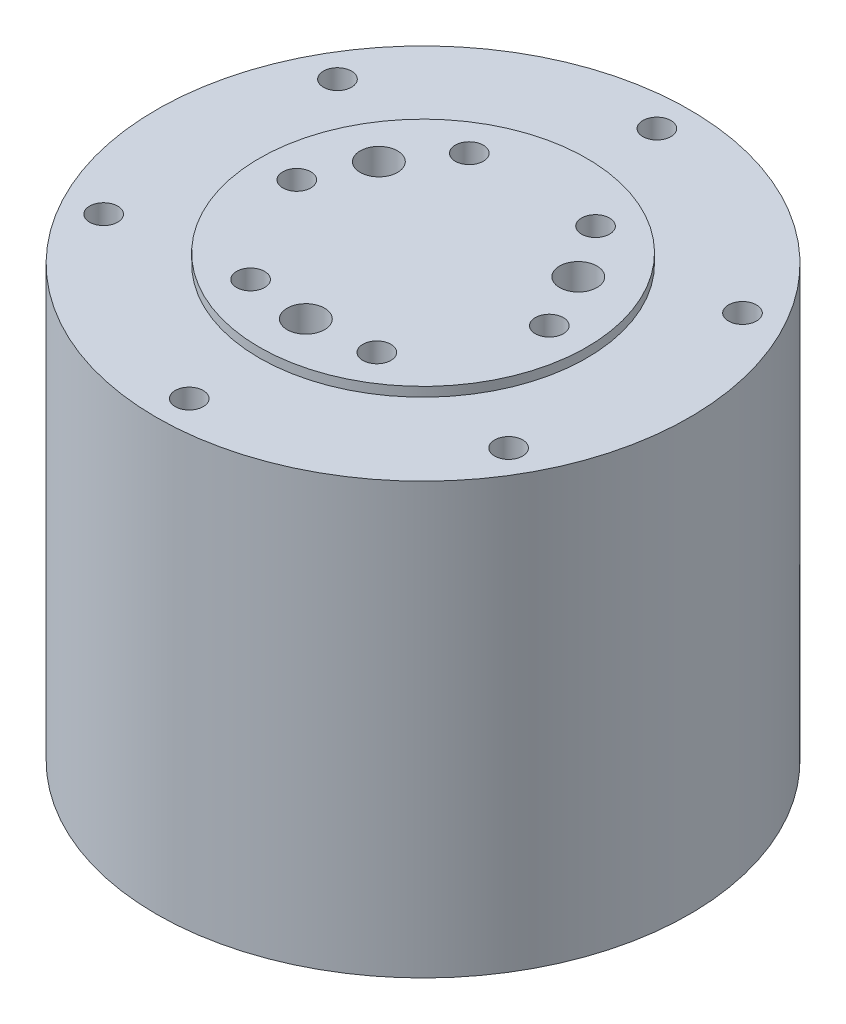
ISO-10303-21;
HEADER;
FILE_DESCRIPTION(('STEP AP214'),'2;1');
FILE_NAME('part.step','',(''),(''),'','','');
FILE_SCHEMA(('AUTOMOTIVE_DESIGN { 1 0 10303 214 1 1 1 1 }'));
ENDSEC;
DATA;
#1=APPLICATION_CONTEXT('core data for automotive mechanical design processes');
#2=APPLICATION_PROTOCOL_DEFINITION('international standard','automotive_design',2000,#1);
#3=PRODUCT_CONTEXT('',#1,'mechanical');
#4=PRODUCT('Part','Part','',(#3));
#5=PRODUCT_RELATED_PRODUCT_CATEGORY('part','',(#4));
#6=PRODUCT_DEFINITION_FORMATION('','',#4);
#7=PRODUCT_DEFINITION_CONTEXT('part definition',#1,'design');
#8=PRODUCT_DEFINITION('design','',#6,#7);
#9=PRODUCT_DEFINITION_SHAPE('','',#8);
#10=(LENGTH_UNIT() NAMED_UNIT(*) SI_UNIT(.MILLI.,.METRE.));
#11=(NAMED_UNIT(*) PLANE_ANGLE_UNIT() SI_UNIT($,.RADIAN.));
#12=(NAMED_UNIT(*) SI_UNIT($,.STERADIAN.) SOLID_ANGLE_UNIT());
#13=UNCERTAINTY_MEASURE_WITH_UNIT(LENGTH_MEASURE(1.E-05),#10,'distance_accuracy_value','');
#14=(GEOMETRIC_REPRESENTATION_CONTEXT(3) GLOBAL_UNCERTAINTY_ASSIGNED_CONTEXT((#13)) GLOBAL_UNIT_ASSIGNED_CONTEXT((#10,
#11,#12)) REPRESENTATION_CONTEXT('',''));
#15=CARTESIAN_POINT('',(0.,0.,0.));
#16=DIRECTION('',(0.,0.,1.));
#17=DIRECTION('',(1.,0.,0.));
#18=AXIS2_PLACEMENT_3D('',#15,#16,#17);
#19=CARTESIAN_POINT('',(0.,46.,0.));
#20=DIRECTION('',(0.,-1.,0.));
#21=DIRECTION('',(0.,0.,-1.));
#22=AXIS2_PLACEMENT_3D('',#19,#20,#21);
#23=CYLINDRICAL_SURFACE('',#22,28.5);
#24=CARTESIAN_POINT('',(0.,46.,0.));
#25=DIRECTION('',(0.,1.,0.));
#26=DIRECTION('',(0.,0.,1.));
#27=AXIS2_PLACEMENT_3D('',#24,#25,#26);
#28=CIRCLE('',#27,28.5);
#29=CARTESIAN_POINT('',(0.,46.,28.5));
#30=VERTEX_POINT('',#29);
#31=EDGE_CURVE('E46',#30,#30,#28,.T.);
#32=ORIENTED_EDGE('',*,*,#31,.F.);
#33=EDGE_LOOP('',(#32));
#34=FACE_BOUND('',#33,.T.);
#35=CARTESIAN_POINT('',(0.,0.,0.));
#36=DIRECTION('',(0.,1.,0.));
#37=DIRECTION('',(0.,0.,1.));
#38=AXIS2_PLACEMENT_3D('',#35,#36,#37);
#39=CIRCLE('',#38,28.5);
#40=CARTESIAN_POINT('',(0.,0.,28.5));
#41=VERTEX_POINT('',#40);
#42=EDGE_CURVE('E42',#41,#41,#39,.T.);
#43=ORIENTED_EDGE('',*,*,#42,.T.);
#44=EDGE_LOOP('',(#43));
#45=FACE_BOUND('',#44,.T.);
#46=ADVANCED_FACE('F39',(#34,#45),#23,.T.);
#47=CARTESIAN_POINT('',(0.,46.,0.));
#48=DIRECTION('',(0.,1.,0.));
#49=DIRECTION('',(0.,0.,1.));
#50=AXIS2_PLACEMENT_3D('',#47,#48,#49);
#51=PLANE('',#50);
#52=CARTESIAN_POINT('',(21.6506350946108,46.,-12.5000000000003));
#53=DIRECTION('',(0.,1.,0.));
#54=DIRECTION('',(-0.866025403784433,0.,0.50000000000001));
#55=AXIS2_PLACEMENT_3D('',#52,#53,#54);
#56=CIRCLE('',#55,1.5);
#57=CARTESIAN_POINT('',(20.3515969889342,46.,-11.7500000000002));
#58=VERTEX_POINT('',#57);
#59=EDGE_CURVE('E146',#58,#58,#56,.T.);
#60=ORIENTED_EDGE('',*,*,#59,.F.);
#61=EDGE_LOOP('',(#60));
#62=FACE_BOUND('',#61,.T.);
#63=CARTESIAN_POINT('',(21.6506350946111,46.,12.4999999999998));
#64=DIRECTION('',(0.,1.,0.));
#65=DIRECTION('',(-0.866025403784443,0.,-0.499999999999992));
#66=AXIS2_PLACEMENT_3D('',#63,#64,#65);
#67=CIRCLE('',#66,1.5);
#68=CARTESIAN_POINT('',(20.3515969889344,46.,11.7499999999998));
#69=VERTEX_POINT('',#68);
#70=EDGE_CURVE('E152',#69,#69,#67,.T.);
#71=ORIENTED_EDGE('',*,*,#70,.F.);
#72=EDGE_LOOP('',(#71));
#73=FACE_BOUND('',#72,.T.);
#74=CARTESIAN_POINT('',(0.,46.,25.));
#75=DIRECTION('',(0.,1.,0.));
#76=DIRECTION('',(0.,0.,-1.));
#77=AXIS2_PLACEMENT_3D('',#74,#75,#76);
#78=CIRCLE('',#77,1.5);
#79=CARTESIAN_POINT('',(0.,46.,23.5));
#80=VERTEX_POINT('',#79);
#81=EDGE_CURVE('E158',#80,#80,#78,.T.);
#82=ORIENTED_EDGE('',*,*,#81,.F.);
#83=EDGE_LOOP('',(#82));
#84=FACE_BOUND('',#83,.T.);
#85=CARTESIAN_POINT('',(-21.6506350946109,46.,12.5000000000001));
#86=DIRECTION('',(0.,1.,0.));
#87=DIRECTION('',(0.866025403784436,0.,-0.500000000000004));
#88=AXIS2_PLACEMENT_3D('',#85,#86,#87);
#89=CIRCLE('',#88,1.5);
#90=CARTESIAN_POINT('',(-20.3515969889343,46.,11.7500000000001));
#91=VERTEX_POINT('',#90);
#92=EDGE_CURVE('E164',#91,#91,#89,.T.);
#93=ORIENTED_EDGE('',*,*,#92,.F.);
#94=EDGE_LOOP('',(#93));
#95=FACE_BOUND('',#94,.T.);
#96=CARTESIAN_POINT('',(-21.650635094611,46.,-12.5));
#97=DIRECTION('',(0.,1.,0.));
#98=DIRECTION('',(0.86602540378444,0.,0.499999999999998));
#99=AXIS2_PLACEMENT_3D('',#96,#97,#98);
#100=CIRCLE('',#99,1.5);
#101=CARTESIAN_POINT('',(-20.3515969889343,46.,-11.75));
#102=VERTEX_POINT('',#101);
#103=EDGE_CURVE('E140',#102,#102,#100,.T.);
#104=ORIENTED_EDGE('',*,*,#103,.F.);
#105=EDGE_LOOP('',(#104));
#106=FACE_BOUND('',#105,.T.);
#107=CARTESIAN_POINT('',(0.,46.,-25.));
#108=DIRECTION('',(0.,1.,0.));
#109=DIRECTION('',(0.,0.,1.));
#110=AXIS2_PLACEMENT_3D('',#107,#108,#109);
#111=CIRCLE('',#110,1.5);
#112=CARTESIAN_POINT('',(0.,46.,-23.5));
#113=VERTEX_POINT('',#112);
#114=EDGE_CURVE('E134',#113,#113,#111,.T.);
#115=ORIENTED_EDGE('',*,*,#114,.F.);
#116=EDGE_LOOP('',(#115));
#117=FACE_BOUND('',#116,.T.);
#118=CARTESIAN_POINT('',(0.,46.,0.));
#119=DIRECTION('',(0.,1.,0.));
#120=DIRECTION('',(0.,0.,1.));
#121=AXIS2_PLACEMENT_3D('',#118,#119,#120);
#122=CIRCLE('',#121,17.5);
#123=CARTESIAN_POINT('',(0.,46.,17.5));
#124=VERTEX_POINT('',#123);
#125=EDGE_CURVE('E10',#124,#124,#122,.T.);
#126=ORIENTED_EDGE('',*,*,#125,.F.);
#127=EDGE_LOOP('',(#126));
#128=FACE_BOUND('',#127,.T.);
#129=ORIENTED_EDGE('',*,*,#31,.T.);
#130=EDGE_LOOP('',(#129));
#131=FACE_BOUND('',#130,.T.);
#132=ADVANCED_FACE('F179',(#62,#73,#84,#95,#106,#117,#128,#131),#51,.T.);
#133=CARTESIAN_POINT('',(0.,0.,0.));
#134=DIRECTION('',(0.,1.,0.));
#135=DIRECTION('',(0.,0.,1.));
#136=AXIS2_PLACEMENT_3D('',#133,#134,#135);
#137=PLANE('',#136);
#138=CARTESIAN_POINT('',(13.4350288425443,0.,-13.4350288425445));
#139=DIRECTION('',(0.,-1.,0.));
#140=DIRECTION('',(-1.,0.,0.));
#141=AXIS2_PLACEMENT_3D('',#138,#139,#140);
#142=CIRCLE('',#141,1.5);
#143=CARTESIAN_POINT('',(11.9350288425443,0.,-13.4350288425445));
#144=VERTEX_POINT('',#143);
#145=EDGE_CURVE('E75',#144,#144,#142,.T.);
#146=ORIENTED_EDGE('',*,*,#145,.F.);
#147=EDGE_LOOP('',(#146));
#148=FACE_BOUND('',#147,.T.);
#149=CARTESIAN_POINT('',(-13.4350288425444,0.,-13.4350288425444));
#150=DIRECTION('',(0.,-1.,0.));
#151=DIRECTION('',(0.,0.,1.));
#152=AXIS2_PLACEMENT_3D('',#149,#150,#151);
#153=CIRCLE('',#152,1.5);
#154=CARTESIAN_POINT('',(-13.4350288425444,0.,-11.9350288425444));
#155=VERTEX_POINT('',#154);
#156=EDGE_CURVE('E69',#155,#155,#153,.T.);
#157=ORIENTED_EDGE('',*,*,#156,.F.);
#158=EDGE_LOOP('',(#157));
#159=FACE_BOUND('',#158,.T.);
#160=CARTESIAN_POINT('',(-13.4350288425442,0.,13.4350288425446));
#161=DIRECTION('',(0.,-1.,0.));
#162=DIRECTION('',(1.,0.,0.));
#163=AXIS2_PLACEMENT_3D('',#160,#161,#162);
#164=CIRCLE('',#163,1.5);
#165=CARTESIAN_POINT('',(-11.9350288425442,0.,13.4350288425445));
#166=VERTEX_POINT('',#165);
#167=EDGE_CURVE('E62',#166,#166,#164,.T.);
#168=ORIENTED_EDGE('',*,*,#167,.F.);
#169=EDGE_LOOP('',(#168));
#170=FACE_BOUND('',#169,.T.);
#171=CARTESIAN_POINT('',(13.4350288425444,0.,13.4350288425444));
#172=DIRECTION('',(0.,-1.,0.));
#173=DIRECTION('',(0.,0.,-1.));
#174=AXIS2_PLACEMENT_3D('',#171,#172,#173);
#175=CIRCLE('',#174,1.5);
#176=CARTESIAN_POINT('',(13.4350288425444,0.,11.9350288425444));
#177=VERTEX_POINT('',#176);
#178=EDGE_CURVE('E56',#177,#177,#175,.T.);
#179=ORIENTED_EDGE('',*,*,#178,.F.);
#180=EDGE_LOOP('',(#179));
#181=FACE_BOUND('',#180,.T.);
#182=ORIENTED_EDGE('',*,*,#42,.F.);
#183=EDGE_LOOP('',(#182));
#184=FACE_BOUND('',#183,.T.);
#185=ADVANCED_FACE('F182',(#148,#159,#170,#181,#184),#137,.F.);
#186=CARTESIAN_POINT('',(0.,47.,0.));
#187=DIRECTION('',(0.,-1.,0.));
#188=DIRECTION('',(0.,0.,-1.));
#189=AXIS2_PLACEMENT_3D('',#186,#187,#188);
#190=CYLINDRICAL_SURFACE('',#189,17.5);
#191=CARTESIAN_POINT('',(0.,47.,0.));
#192=DIRECTION('',(0.,1.,0.));
#193=DIRECTION('',(0.,0.,1.));
#194=AXIS2_PLACEMENT_3D('',#191,#192,#193);
#195=CIRCLE('',#194,17.5);
#196=CARTESIAN_POINT('',(0.,47.,17.5));
#197=VERTEX_POINT('',#196);
#198=EDGE_CURVE('E52',#197,#197,#195,.T.);
#199=ORIENTED_EDGE('',*,*,#198,.F.);
#200=EDGE_LOOP('',(#199));
#201=FACE_BOUND('',#200,.T.);
#202=ORIENTED_EDGE('',*,*,#125,.T.);
#203=EDGE_LOOP('',(#202));
#204=FACE_BOUND('',#203,.T.);
#205=ADVANCED_FACE('F198',(#201,#204),#190,.T.);
#206=CARTESIAN_POINT('',(0.,47.,0.));
#207=DIRECTION('',(0.,1.,0.));
#208=DIRECTION('',(0.,0.,1.));
#209=AXIS2_PLACEMENT_3D('',#206,#207,#208);
#210=PLANE('',#209);
#211=CARTESIAN_POINT('',(6.75000000000014,47.,11.6913429510898));
#212=DIRECTION('',(0.,1.,0.));
#213=DIRECTION('',(-0.866025403784433,0.,0.50000000000001));
#214=AXIS2_PLACEMENT_3D('',#211,#212,#213);
#215=CIRCLE('',#214,1.5);
#216=CARTESIAN_POINT('',(5.45096189432349,47.,12.4413429510899));
#217=VERTEX_POINT('',#216);
#218=EDGE_CURVE('E110',#217,#217,#215,.T.);
#219=ORIENTED_EDGE('',*,*,#218,.F.);
#220=EDGE_LOOP('',(#219));
#221=FACE_BOUND('',#220,.T.);
#222=CARTESIAN_POINT('',(-6.74999999999989,47.,11.69134295109));
#223=DIRECTION('',(0.,1.,0.));
#224=DIRECTION('',(-0.866025403784443,0.,-0.499999999999992));
#225=AXIS2_PLACEMENT_3D('',#222,#223,#224);
#226=CIRCLE('',#225,1.5);
#227=CARTESIAN_POINT('',(-8.04903810567655,47.,10.94134295109));
#228=VERTEX_POINT('',#227);
#229=EDGE_CURVE('E117',#228,#228,#226,.T.);
#230=ORIENTED_EDGE('',*,*,#229,.F.);
#231=EDGE_LOOP('',(#230));
#232=FACE_BOUND('',#231,.T.);
#233=CARTESIAN_POINT('',(-13.5,47.,0.));
#234=DIRECTION('',(0.,1.,0.));
#235=DIRECTION('',(0.,0.,-1.));
#236=AXIS2_PLACEMENT_3D('',#233,#234,#235);
#237=CIRCLE('',#236,1.5);
#238=CARTESIAN_POINT('',(-13.5,47.,-1.5));
#239=VERTEX_POINT('',#238);
#240=EDGE_CURVE('E123',#239,#239,#237,.T.);
#241=ORIENTED_EDGE('',*,*,#240,.F.);
#242=EDGE_LOOP('',(#241));
#243=FACE_BOUND('',#242,.T.);
#244=CARTESIAN_POINT('',(-6.75000000000006,47.,-11.6913429510899));
#245=DIRECTION('',(0.,1.,0.));
#246=DIRECTION('',(0.866025403784436,0.,-0.500000000000004));
#247=AXIS2_PLACEMENT_3D('',#244,#245,#246);
#248=CIRCLE('',#247,1.5);
#249=CARTESIAN_POINT('',(-5.4509618943234,47.,-12.4413429510899));
#250=VERTEX_POINT('',#249);
#251=EDGE_CURVE('E129',#250,#250,#248,.T.);
#252=ORIENTED_EDGE('',*,*,#251,.F.);
#253=EDGE_LOOP('',(#252));
#254=FACE_BOUND('',#253,.T.);
#255=CARTESIAN_POINT('',(6.74999999999997,47.,-11.6913429510899));
#256=DIRECTION('',(0.,1.,0.));
#257=DIRECTION('',(0.86602540378444,0.,0.499999999999998));
#258=AXIS2_PLACEMENT_3D('',#255,#256,#257);
#259=CIRCLE('',#258,1.5);
#260=CARTESIAN_POINT('',(8.04903810567663,47.,-10.9413429510899));
#261=VERTEX_POINT('',#260);
#262=EDGE_CURVE('E104',#261,#261,#259,.T.);
#263=ORIENTED_EDGE('',*,*,#262,.F.);
#264=EDGE_LOOP('',(#263));
#265=FACE_BOUND('',#264,.T.);
#266=CARTESIAN_POINT('',(13.5,47.,0.));
#267=DIRECTION('',(0.,1.,0.));
#268=DIRECTION('',(0.,0.,1.));
#269=AXIS2_PLACEMENT_3D('',#266,#267,#268);
#270=CIRCLE('',#269,1.5);
#271=CARTESIAN_POINT('',(13.5,47.,1.5));
#272=VERTEX_POINT('',#271);
#273=EDGE_CURVE('E98',#272,#272,#270,.T.);
#274=ORIENTED_EDGE('',*,*,#273,.F.);
#275=EDGE_LOOP('',(#274));
#276=FACE_BOUND('',#275,.T.);
#277=CARTESIAN_POINT('',(-10.8007121108952,47.,-6.07499999999997));
#278=DIRECTION('',(0.,1.,0.));
#279=DIRECTION('',(0.866025403784436,0.,-0.500000000000004));
#280=AXIS2_PLACEMENT_3D('',#277,#278,#279);
#281=CIRCLE('',#280,2.);
#282=CARTESIAN_POINT('',(-9.06866130332638,47.,-7.07499999999998));
#283=VERTEX_POINT('',#282);
#284=EDGE_CURVE('E93',#283,#283,#281,.T.);
#285=ORIENTED_EDGE('',*,*,#284,.F.);
#286=EDGE_LOOP('',(#285));
#287=FACE_BOUND('',#286,.T.);
#288=CARTESIAN_POINT('',(-0.13925172745706,47.,12.3911910669975));
#289=DIRECTION('',(0.,1.,0.));
#290=DIRECTION('',(-0.866025403784443,0.,-0.499999999999992));
#291=AXIS2_PLACEMENT_3D('',#288,#289,#290);
#292=CIRCLE('',#291,2.);
#293=CARTESIAN_POINT('',(-1.87130253502595,47.,11.3911910669975));
#294=VERTEX_POINT('',#293);
#295=EDGE_CURVE('E86',#294,#294,#292,.T.);
#296=ORIENTED_EDGE('',*,*,#295,.F.);
#297=EDGE_LOOP('',(#296));
#298=FACE_BOUND('',#297,.T.);
#299=CARTESIAN_POINT('',(10.5222086559809,47.,-6.07499999999998));
#300=DIRECTION('',(0.,1.,0.));
#301=DIRECTION('',(0.,0.,1.));
#302=AXIS2_PLACEMENT_3D('',#299,#300,#301);
#303=CIRCLE('',#302,2.);
#304=CARTESIAN_POINT('',(10.5222086559809,47.,-4.07499999999998));
#305=VERTEX_POINT('',#304);
#306=EDGE_CURVE('E80',#305,#305,#303,.T.);
#307=ORIENTED_EDGE('',*,*,#306,.F.);
#308=EDGE_LOOP('',(#307));
#309=FACE_BOUND('',#308,.T.);
#310=ORIENTED_EDGE('',*,*,#198,.T.);
#311=EDGE_LOOP('',(#310));
#312=FACE_BOUND('',#311,.T.);
#313=ADVANCED_FACE('F205',(#221,#232,#243,#254,#265,#276,#287,#298,#309,#312),#210,.T.);
#314=CARTESIAN_POINT('',(13.4350288425444,4.,13.4350288425444));
#315=DIRECTION('',(0.,-1.,0.));
#316=DIRECTION('',(0.,0.,-1.));
#317=AXIS2_PLACEMENT_3D('',#314,#315,#316);
#318=CYLINDRICAL_SURFACE('',#317,1.5);
#319=CARTESIAN_POINT('',(13.4350288425444,4.,13.4350288425444));
#320=DIRECTION('',(0.,-1.,0.));
#321=DIRECTION('',(0.,0.,-1.));
#322=AXIS2_PLACEMENT_3D('',#319,#320,#321);
#323=CIRCLE('',#322,1.5);
#324=CARTESIAN_POINT('',(13.4350288425444,4.,11.9350288425444));
#325=VERTEX_POINT('',#324);
#326=EDGE_CURVE('E55',#325,#325,#323,.T.);
#327=ORIENTED_EDGE('',*,*,#326,.F.);
#328=EDGE_LOOP('',(#327));
#329=FACE_BOUND('',#328,.T.);
#330=ORIENTED_EDGE('',*,*,#178,.T.);
#331=EDGE_LOOP('',(#330));
#332=FACE_BOUND('',#331,.T.);
#333=ADVANCED_FACE('F213',(#329,#332),#318,.F.);
#334=CARTESIAN_POINT('',(13.4350288425444,4.,13.4350288425444));
#335=DIRECTION('',(0.,-1.,0.));
#336=DIRECTION('',(0.,0.,-1.));
#337=AXIS2_PLACEMENT_3D('',#334,#335,#336);
#338=PLANE('',#337);
#339=ORIENTED_EDGE('',*,*,#326,.T.);
#340=EDGE_LOOP('',(#339));
#341=FACE_BOUND('',#340,.T.);
#342=ADVANCED_FACE('F217',(#341),#338,.T.);
#343=CARTESIAN_POINT('',(-13.4350288425442,4.,13.4350288425446));
#344=DIRECTION('',(0.,-1.,0.));
#345=DIRECTION('',(0.,0.,-1.));
#346=AXIS2_PLACEMENT_3D('',#343,#344,#345);
#347=CYLINDRICAL_SURFACE('',#346,1.5);
#348=CARTESIAN_POINT('',(-13.4350288425442,4.,13.4350288425446));
#349=DIRECTION('',(0.,-1.,0.));
#350=DIRECTION('',(1.,0.,0.));
#351=AXIS2_PLACEMENT_3D('',#348,#349,#350);
#352=CIRCLE('',#351,1.5);
#353=CARTESIAN_POINT('',(-11.9350288425442,4.,13.4350288425445));
#354=VERTEX_POINT('',#353);
#355=EDGE_CURVE('E65',#354,#354,#352,.T.);
#356=ORIENTED_EDGE('',*,*,#355,.F.);
#357=EDGE_LOOP('',(#356));
#358=FACE_BOUND('',#357,.T.);
#359=ORIENTED_EDGE('',*,*,#167,.T.);
#360=EDGE_LOOP('',(#359));
#361=FACE_BOUND('',#360,.T.);
#362=ADVANCED_FACE('F220',(#358,#361),#347,.F.);
#363=CARTESIAN_POINT('',(-13.4350288425442,4.,13.4350288425446));
#364=DIRECTION('',(0.,-1.,0.));
#365=DIRECTION('',(1.,0.,0.));
#366=AXIS2_PLACEMENT_3D('',#363,#364,#365);
#367=PLANE('',#366);
#368=ORIENTED_EDGE('',*,*,#355,.T.);
#369=EDGE_LOOP('',(#368));
#370=FACE_BOUND('',#369,.T.);
#371=ADVANCED_FACE('F223',(#370),#367,.T.);
#372=CARTESIAN_POINT('',(-13.4350288425444,4.,-13.4350288425444));
#373=DIRECTION('',(0.,-1.,0.));
#374=DIRECTION('',(0.,0.,-1.));
#375=AXIS2_PLACEMENT_3D('',#372,#373,#374);
#376=CYLINDRICAL_SURFACE('',#375,1.5);
#377=CARTESIAN_POINT('',(-13.4350288425444,4.,-13.4350288425444));
#378=DIRECTION('',(0.,-1.,0.));
#379=DIRECTION('',(0.,0.,1.));
#380=AXIS2_PLACEMENT_3D('',#377,#378,#379);
#381=CIRCLE('',#380,1.5);
#382=CARTESIAN_POINT('',(-13.4350288425444,4.,-11.9350288425444));
#383=VERTEX_POINT('',#382);
#384=EDGE_CURVE('E72',#383,#383,#381,.T.);
#385=ORIENTED_EDGE('',*,*,#384,.F.);
#386=EDGE_LOOP('',(#385));
#387=FACE_BOUND('',#386,.T.);
#388=ORIENTED_EDGE('',*,*,#156,.T.);
#389=EDGE_LOOP('',(#388));
#390=FACE_BOUND('',#389,.T.);
#391=ADVANCED_FACE('F227',(#387,#390),#376,.F.);
#392=CARTESIAN_POINT('',(-13.4350288425444,4.,-13.4350288425444));
#393=DIRECTION('',(0.,-1.,0.));
#394=DIRECTION('',(0.,0.,1.));
#395=AXIS2_PLACEMENT_3D('',#392,#393,#394);
#396=PLANE('',#395);
#397=ORIENTED_EDGE('',*,*,#384,.T.);
#398=EDGE_LOOP('',(#397));
#399=FACE_BOUND('',#398,.T.);
#400=ADVANCED_FACE('F231',(#399),#396,.T.);
#401=CARTESIAN_POINT('',(13.4350288425443,4.,-13.4350288425445));
#402=DIRECTION('',(0.,-1.,0.));
#403=DIRECTION('',(0.,0.,-1.));
#404=AXIS2_PLACEMENT_3D('',#401,#402,#403);
#405=CYLINDRICAL_SURFACE('',#404,1.5);
#406=CARTESIAN_POINT('',(13.4350288425443,4.,-13.4350288425445));
#407=DIRECTION('',(0.,-1.,0.));
#408=DIRECTION('',(-1.,0.,0.));
#409=AXIS2_PLACEMENT_3D('',#406,#407,#408);
#410=CIRCLE('',#409,1.5);
#411=CARTESIAN_POINT('',(11.9350288425443,4.,-13.4350288425445));
#412=VERTEX_POINT('',#411);
#413=EDGE_CURVE('E59',#412,#412,#410,.T.);
#414=ORIENTED_EDGE('',*,*,#413,.F.);
#415=EDGE_LOOP('',(#414));
#416=FACE_BOUND('',#415,.T.);
#417=ORIENTED_EDGE('',*,*,#145,.T.);
#418=EDGE_LOOP('',(#417));
#419=FACE_BOUND('',#418,.T.);
#420=ADVANCED_FACE('F235',(#416,#419),#405,.F.);
#421=CARTESIAN_POINT('',(13.4350288425443,4.,-13.4350288425445));
#422=DIRECTION('',(0.,-1.,0.));
#423=DIRECTION('',(-1.,0.,0.));
#424=AXIS2_PLACEMENT_3D('',#421,#422,#423);
#425=PLANE('',#424);
#426=ORIENTED_EDGE('',*,*,#413,.T.);
#427=EDGE_LOOP('',(#426));
#428=FACE_BOUND('',#427,.T.);
#429=ADVANCED_FACE('F239',(#428),#425,.T.);
#430=CARTESIAN_POINT('',(10.5222086559809,43.,-6.07499999999998));
#431=DIRECTION('',(0.,1.,0.));
#432=DIRECTION('',(0.,0.,1.));
#433=AXIS2_PLACEMENT_3D('',#430,#431,#432);
#434=CYLINDRICAL_SURFACE('',#433,2.);
#435=CARTESIAN_POINT('',(10.5222086559809,43.,-6.07499999999998));
#436=DIRECTION('',(0.,1.,0.));
#437=DIRECTION('',(0.,0.,1.));
#438=AXIS2_PLACEMENT_3D('',#435,#436,#437);
#439=CIRCLE('',#438,2.);
#440=CARTESIAN_POINT('',(10.5222086559809,43.,-4.07499999999998));
#441=VERTEX_POINT('',#440);
#442=EDGE_CURVE('E66',#441,#441,#439,.T.);
#443=ORIENTED_EDGE('',*,*,#442,.F.);
#444=EDGE_LOOP('',(#443));
#445=FACE_BOUND('',#444,.T.);
#446=ORIENTED_EDGE('',*,*,#306,.T.);
#447=EDGE_LOOP('',(#446));
#448=FACE_BOUND('',#447,.T.);
#449=ADVANCED_FACE('F243',(#445,#448),#434,.F.);
#450=CARTESIAN_POINT('',(10.5222086559809,43.,-6.07499999999998));
#451=DIRECTION('',(0.,1.,0.));
#452=DIRECTION('',(0.,0.,1.));
#453=AXIS2_PLACEMENT_3D('',#450,#451,#452);
#454=PLANE('',#453);
#455=ORIENTED_EDGE('',*,*,#442,.T.);
#456=EDGE_LOOP('',(#455));
#457=FACE_BOUND('',#456,.T.);
#458=ADVANCED_FACE('F247',(#457),#454,.T.);
#459=CARTESIAN_POINT('',(-0.13925172745706,43.,12.3911910669975));
#460=DIRECTION('',(0.,1.,0.));
#461=DIRECTION('',(0.,0.,1.));
#462=AXIS2_PLACEMENT_3D('',#459,#460,#461);
#463=CYLINDRICAL_SURFACE('',#462,2.);
#464=CARTESIAN_POINT('',(-0.13925172745706,43.,12.3911910669975));
#465=DIRECTION('',(0.,1.,0.));
#466=DIRECTION('',(-0.866025403784443,0.,-0.499999999999992));
#467=AXIS2_PLACEMENT_3D('',#464,#465,#466);
#468=CIRCLE('',#467,2.);
#469=CARTESIAN_POINT('',(-1.87130253502595,43.,11.3911910669975));
#470=VERTEX_POINT('',#469);
#471=EDGE_CURVE('E89',#470,#470,#468,.T.);
#472=ORIENTED_EDGE('',*,*,#471,.F.);
#473=EDGE_LOOP('',(#472));
#474=FACE_BOUND('',#473,.T.);
#475=ORIENTED_EDGE('',*,*,#295,.T.);
#476=EDGE_LOOP('',(#475));
#477=FACE_BOUND('',#476,.T.);
#478=ADVANCED_FACE('F251',(#474,#477),#463,.F.);
#479=CARTESIAN_POINT('',(-0.13925172745706,43.,12.3911910669975));
#480=DIRECTION('',(0.,1.,0.));
#481=DIRECTION('',(-0.866025403784443,0.,-0.499999999999992));
#482=AXIS2_PLACEMENT_3D('',#479,#480,#481);
#483=PLANE('',#482);
#484=ORIENTED_EDGE('',*,*,#471,.T.);
#485=EDGE_LOOP('',(#484));
#486=FACE_BOUND('',#485,.T.);
#487=ADVANCED_FACE('F255',(#486),#483,.T.);
#488=CARTESIAN_POINT('',(-10.8007121108952,43.,-6.07499999999997));
#489=DIRECTION('',(0.,1.,0.));
#490=DIRECTION('',(0.,0.,1.));
#491=AXIS2_PLACEMENT_3D('',#488,#489,#490);
#492=CYLINDRICAL_SURFACE('',#491,2.);
#493=CARTESIAN_POINT('',(-10.8007121108952,43.,-6.07499999999997));
#494=DIRECTION('',(0.,1.,0.));
#495=DIRECTION('',(0.866025403784436,0.,-0.500000000000004));
#496=AXIS2_PLACEMENT_3D('',#493,#494,#495);
#497=CIRCLE('',#496,2.);
#498=CARTESIAN_POINT('',(-9.06866130332638,43.,-7.07499999999998));
#499=VERTEX_POINT('',#498);
#500=EDGE_CURVE('E83',#499,#499,#497,.T.);
#501=ORIENTED_EDGE('',*,*,#500,.F.);
#502=EDGE_LOOP('',(#501));
#503=FACE_BOUND('',#502,.T.);
#504=ORIENTED_EDGE('',*,*,#284,.T.);
#505=EDGE_LOOP('',(#504));
#506=FACE_BOUND('',#505,.T.);
#507=ADVANCED_FACE('F259',(#503,#506),#492,.F.);
#508=CARTESIAN_POINT('',(-10.8007121108952,43.,-6.07499999999997));
#509=DIRECTION('',(0.,1.,0.));
#510=DIRECTION('',(0.866025403784436,0.,-0.500000000000004));
#511=AXIS2_PLACEMENT_3D('',#508,#509,#510);
#512=PLANE('',#511);
#513=ORIENTED_EDGE('',*,*,#500,.T.);
#514=EDGE_LOOP('',(#513));
#515=FACE_BOUND('',#514,.T.);
#516=ADVANCED_FACE('F263',(#515),#512,.T.);
#517=CARTESIAN_POINT('',(13.5,42.,0.));
#518=DIRECTION('',(0.,1.,0.));
#519=DIRECTION('',(0.,0.,1.));
#520=AXIS2_PLACEMENT_3D('',#517,#518,#519);
#521=CYLINDRICAL_SURFACE('',#520,1.5);
#522=CARTESIAN_POINT('',(13.5,42.,0.));
#523=DIRECTION('',(0.,1.,0.));
#524=DIRECTION('',(0.,0.,1.));
#525=AXIS2_PLACEMENT_3D('',#522,#523,#524);
#526=CIRCLE('',#525,1.5);
#527=CARTESIAN_POINT('',(13.5,42.,1.5));
#528=VERTEX_POINT('',#527);
#529=EDGE_CURVE('E90',#528,#528,#526,.T.);
#530=ORIENTED_EDGE('',*,*,#529,.F.);
#531=EDGE_LOOP('',(#530));
#532=FACE_BOUND('',#531,.T.);
#533=ORIENTED_EDGE('',*,*,#273,.T.);
#534=EDGE_LOOP('',(#533));
#535=FACE_BOUND('',#534,.T.);
#536=ADVANCED_FACE('F267',(#532,#535),#521,.F.);
#537=CARTESIAN_POINT('',(13.5,42.,0.));
#538=DIRECTION('',(0.,1.,0.));
#539=DIRECTION('',(0.,0.,1.));
#540=AXIS2_PLACEMENT_3D('',#537,#538,#539);
#541=PLANE('',#540);
#542=ORIENTED_EDGE('',*,*,#529,.T.);
#543=EDGE_LOOP('',(#542));
#544=FACE_BOUND('',#543,.T.);
#545=ADVANCED_FACE('F271',(#544),#541,.T.);
#546=CARTESIAN_POINT('',(6.74999999999997,42.,-11.6913429510899));
#547=DIRECTION('',(0.,1.,0.));
#548=DIRECTION('',(0.,0.,1.));
#549=AXIS2_PLACEMENT_3D('',#546,#547,#548);
#550=CYLINDRICAL_SURFACE('',#549,1.5);
#551=CARTESIAN_POINT('',(6.74999999999997,42.,-11.6913429510899));
#552=DIRECTION('',(0.,1.,0.));
#553=DIRECTION('',(0.86602540378444,0.,0.499999999999998));
#554=AXIS2_PLACEMENT_3D('',#551,#552,#553);
#555=CIRCLE('',#554,1.5);
#556=CARTESIAN_POINT('',(8.04903810567663,42.,-10.9413429510899));
#557=VERTEX_POINT('',#556);
#558=EDGE_CURVE('E101',#557,#557,#555,.T.);
#559=ORIENTED_EDGE('',*,*,#558,.F.);
#560=EDGE_LOOP('',(#559));
#561=FACE_BOUND('',#560,.T.);
#562=ORIENTED_EDGE('',*,*,#262,.T.);
#563=EDGE_LOOP('',(#562));
#564=FACE_BOUND('',#563,.T.);
#565=ADVANCED_FACE('F275',(#561,#564),#550,.F.);
#566=CARTESIAN_POINT('',(6.74999999999997,42.,-11.6913429510899));
#567=DIRECTION('',(0.,1.,0.));
#568=DIRECTION('',(0.86602540378444,0.,0.499999999999998));
#569=AXIS2_PLACEMENT_3D('',#566,#567,#568);
#570=PLANE('',#569);
#571=ORIENTED_EDGE('',*,*,#558,.T.);
#572=EDGE_LOOP('',(#571));
#573=FACE_BOUND('',#572,.T.);
#574=ADVANCED_FACE('F279',(#573),#570,.T.);
#575=CARTESIAN_POINT('',(-6.75000000000006,42.,-11.6913429510899));
#576=DIRECTION('',(0.,1.,0.));
#577=DIRECTION('',(0.,0.,1.));
#578=AXIS2_PLACEMENT_3D('',#575,#576,#577);
#579=CYLINDRICAL_SURFACE('',#578,1.5);
#580=CARTESIAN_POINT('',(-6.75000000000006,42.,-11.6913429510899));
#581=DIRECTION('',(0.,1.,0.));
#582=DIRECTION('',(0.866025403784436,0.,-0.500000000000004));
#583=AXIS2_PLACEMENT_3D('',#580,#581,#582);
#584=CIRCLE('',#583,1.5);
#585=CARTESIAN_POINT('',(-5.4509618943234,42.,-12.4413429510899));
#586=VERTEX_POINT('',#585);
#587=EDGE_CURVE('E107',#586,#586,#584,.T.);
#588=ORIENTED_EDGE('',*,*,#587,.F.);
#589=EDGE_LOOP('',(#588));
#590=FACE_BOUND('',#589,.T.);
#591=ORIENTED_EDGE('',*,*,#251,.T.);
#592=EDGE_LOOP('',(#591));
#593=FACE_BOUND('',#592,.T.);
#594=ADVANCED_FACE('F283',(#590,#593),#579,.F.);
#595=CARTESIAN_POINT('',(-6.75000000000006,42.,-11.6913429510899));
#596=DIRECTION('',(0.,1.,0.));
#597=DIRECTION('',(0.866025403784436,0.,-0.500000000000004));
#598=AXIS2_PLACEMENT_3D('',#595,#596,#597);
#599=PLANE('',#598);
#600=ORIENTED_EDGE('',*,*,#587,.T.);
#601=EDGE_LOOP('',(#600));
#602=FACE_BOUND('',#601,.T.);
#603=ADVANCED_FACE('F306',(#602),#599,.T.);
#604=CARTESIAN_POINT('',(-13.5,42.,0.));
#605=DIRECTION('',(0.,1.,0.));
#606=DIRECTION('',(0.,0.,1.));
#607=AXIS2_PLACEMENT_3D('',#604,#605,#606);
#608=CYLINDRICAL_SURFACE('',#607,1.5);
#609=CARTESIAN_POINT('',(-13.5,42.,0.));
#610=DIRECTION('',(0.,1.,0.));
#611=DIRECTION('',(0.,0.,-1.));
#612=AXIS2_PLACEMENT_3D('',#609,#610,#611);
#613=CIRCLE('',#612,1.5);
#614=CARTESIAN_POINT('',(-13.5,42.,-1.5));
#615=VERTEX_POINT('',#614);
#616=EDGE_CURVE('E126',#615,#615,#613,.T.);
#617=ORIENTED_EDGE('',*,*,#616,.F.);
#618=EDGE_LOOP('',(#617));
#619=FACE_BOUND('',#618,.T.);
#620=ORIENTED_EDGE('',*,*,#240,.T.);
#621=EDGE_LOOP('',(#620));
#622=FACE_BOUND('',#621,.T.);
#623=ADVANCED_FACE('F303',(#619,#622),#608,.F.);
#624=CARTESIAN_POINT('',(-13.5,42.,0.));
#625=DIRECTION('',(0.,1.,0.));
#626=DIRECTION('',(0.,0.,-1.));
#627=AXIS2_PLACEMENT_3D('',#624,#625,#626);
#628=PLANE('',#627);
#629=ORIENTED_EDGE('',*,*,#616,.T.);
#630=EDGE_LOOP('',(#629));
#631=FACE_BOUND('',#630,.T.);
#632=ADVANCED_FACE('F298',(#631),#628,.T.);
#633=CARTESIAN_POINT('',(-6.74999999999989,42.,11.69134295109));
#634=DIRECTION('',(0.,1.,0.));
#635=DIRECTION('',(0.,0.,1.));
#636=AXIS2_PLACEMENT_3D('',#633,#634,#635);
#637=CYLINDRICAL_SURFACE('',#636,1.5);
#638=CARTESIAN_POINT('',(-6.74999999999989,42.,11.69134295109));
#639=DIRECTION('',(0.,1.,0.));
#640=DIRECTION('',(-0.866025403784443,0.,-0.499999999999992));
#641=AXIS2_PLACEMENT_3D('',#638,#639,#640);
#642=CIRCLE('',#641,1.5);
#643=CARTESIAN_POINT('',(-8.04903810567655,42.,10.94134295109));
#644=VERTEX_POINT('',#643);
#645=EDGE_CURVE('E120',#644,#644,#642,.T.);
#646=ORIENTED_EDGE('',*,*,#645,.F.);
#647=EDGE_LOOP('',(#646));
#648=FACE_BOUND('',#647,.T.);
#649=ORIENTED_EDGE('',*,*,#229,.T.);
#650=EDGE_LOOP('',(#649));
#651=FACE_BOUND('',#650,.T.);
#652=ADVANCED_FACE('F295',(#648,#651),#637,.F.);
#653=CARTESIAN_POINT('',(-6.74999999999989,42.,11.69134295109));
#654=DIRECTION('',(0.,1.,0.));
#655=DIRECTION('',(-0.866025403784443,0.,-0.499999999999992));
#656=AXIS2_PLACEMENT_3D('',#653,#654,#655);
#657=PLANE('',#656);
#658=ORIENTED_EDGE('',*,*,#645,.T.);
#659=EDGE_LOOP('',(#658));
#660=FACE_BOUND('',#659,.T.);
#661=ADVANCED_FACE('F289',(#660),#657,.T.);
#662=CARTESIAN_POINT('',(6.75000000000014,42.,11.6913429510898));
#663=DIRECTION('',(0.,1.,0.));
#664=DIRECTION('',(0.,0.,1.));
#665=AXIS2_PLACEMENT_3D('',#662,#663,#664);
#666=CYLINDRICAL_SURFACE('',#665,1.5);
#667=CARTESIAN_POINT('',(6.75000000000014,42.,11.6913429510898));
#668=DIRECTION('',(0.,1.,0.));
#669=DIRECTION('',(-0.866025403784433,0.,0.50000000000001));
#670=AXIS2_PLACEMENT_3D('',#667,#668,#669);
#671=CIRCLE('',#670,1.5);
#672=CARTESIAN_POINT('',(5.45096189432349,42.,12.4413429510899));
#673=VERTEX_POINT('',#672);
#674=EDGE_CURVE('E113',#673,#673,#671,.T.);
#675=ORIENTED_EDGE('',*,*,#674,.F.);
#676=EDGE_LOOP('',(#675));
#677=FACE_BOUND('',#676,.T.);
#678=ORIENTED_EDGE('',*,*,#218,.T.);
#679=EDGE_LOOP('',(#678));
#680=FACE_BOUND('',#679,.T.);
#681=ADVANCED_FACE('F285',(#677,#680),#666,.F.);
#682=CARTESIAN_POINT('',(6.75000000000014,42.,11.6913429510898));
#683=DIRECTION('',(0.,1.,0.));
#684=DIRECTION('',(-0.866025403784433,0.,0.50000000000001));
#685=AXIS2_PLACEMENT_3D('',#682,#683,#684);
#686=PLANE('',#685);
#687=ORIENTED_EDGE('',*,*,#674,.T.);
#688=EDGE_LOOP('',(#687));
#689=FACE_BOUND('',#688,.T.);
#690=ADVANCED_FACE('F288',(#689),#686,.T.);
#691=CARTESIAN_POINT('',(0.,41.,-25.));
#692=DIRECTION('',(0.,1.,0.));
#693=DIRECTION('',(0.,0.,1.));
#694=AXIS2_PLACEMENT_3D('',#691,#692,#693);
#695=CYLINDRICAL_SURFACE('',#694,1.5);
#696=CARTESIAN_POINT('',(0.,41.,-25.));
#697=DIRECTION('',(0.,1.,0.));
#698=DIRECTION('',(0.,0.,1.));
#699=AXIS2_PLACEMENT_3D('',#696,#697,#698);
#700=CIRCLE('',#699,1.5);
#701=CARTESIAN_POINT('',(0.,41.,-23.5));
#702=VERTEX_POINT('',#701);
#703=EDGE_CURVE('E114',#702,#702,#700,.T.);
#704=ORIENTED_EDGE('',*,*,#703,.F.);
#705=EDGE_LOOP('',(#704));
#706=FACE_BOUND('',#705,.T.);
#707=ORIENTED_EDGE('',*,*,#114,.T.);
#708=EDGE_LOOP('',(#707));
#709=FACE_BOUND('',#708,.T.);
#710=ADVANCED_FACE('F293',(#706,#709),#695,.F.);
#711=CARTESIAN_POINT('',(0.,41.,-25.));
#712=DIRECTION('',(0.,1.,0.));
#713=DIRECTION('',(0.,0.,1.));
#714=AXIS2_PLACEMENT_3D('',#711,#712,#713);
#715=PLANE('',#714);
#716=ORIENTED_EDGE('',*,*,#703,.T.);
#717=EDGE_LOOP('',(#716));
#718=FACE_BOUND('',#717,.T.);
#719=ADVANCED_FACE('F319',(#718),#715,.T.);
#720=CARTESIAN_POINT('',(-21.650635094611,41.,-12.5));
#721=DIRECTION('',(0.,1.,0.));
#722=DIRECTION('',(0.,0.,1.));
#723=AXIS2_PLACEMENT_3D('',#720,#721,#722);
#724=CYLINDRICAL_SURFACE('',#723,1.5);
#725=CARTESIAN_POINT('',(-21.650635094611,41.,-12.5));
#726=DIRECTION('',(0.,1.,0.));
#727=DIRECTION('',(0.86602540378444,0.,0.499999999999998));
#728=AXIS2_PLACEMENT_3D('',#725,#726,#727);
#729=CIRCLE('',#728,1.5);
#730=CARTESIAN_POINT('',(-20.3515969889343,41.,-11.75));
#731=VERTEX_POINT('',#730);
#732=EDGE_CURVE('E137',#731,#731,#729,.T.);
#733=ORIENTED_EDGE('',*,*,#732,.F.);
#734=EDGE_LOOP('',(#733));
#735=FACE_BOUND('',#734,.T.);
#736=ORIENTED_EDGE('',*,*,#103,.T.);
#737=EDGE_LOOP('',(#736));
#738=FACE_BOUND('',#737,.T.);
#739=ADVANCED_FACE('F323',(#735,#738),#724,.F.);
#740=CARTESIAN_POINT('',(-21.650635094611,41.,-12.5));
#741=DIRECTION('',(0.,1.,0.));
#742=DIRECTION('',(0.86602540378444,0.,0.499999999999998));
#743=AXIS2_PLACEMENT_3D('',#740,#741,#742);
#744=PLANE('',#743);
#745=ORIENTED_EDGE('',*,*,#732,.T.);
#746=EDGE_LOOP('',(#745));
#747=FACE_BOUND('',#746,.T.);
#748=ADVANCED_FACE('F175',(#747),#744,.T.);
#749=CARTESIAN_POINT('',(-21.6506350946109,41.,12.5000000000001));
#750=DIRECTION('',(0.,1.,0.));
#751=DIRECTION('',(0.,0.,1.));
#752=AXIS2_PLACEMENT_3D('',#749,#750,#751);
#753=CYLINDRICAL_SURFACE('',#752,1.5);
#754=CARTESIAN_POINT('',(-21.6506350946109,41.,12.5000000000001));
#755=DIRECTION('',(0.,1.,0.));
#756=DIRECTION('',(0.866025403784436,0.,-0.500000000000004));
#757=AXIS2_PLACEMENT_3D('',#754,#755,#756);
#758=CIRCLE('',#757,1.5);
#759=CARTESIAN_POINT('',(-20.3515969889343,41.,11.7500000000001));
#760=VERTEX_POINT('',#759);
#761=EDGE_CURVE('E143',#760,#760,#758,.T.);
#762=ORIENTED_EDGE('',*,*,#761,.F.);
#763=EDGE_LOOP('',(#762));
#764=FACE_BOUND('',#763,.T.);
#765=ORIENTED_EDGE('',*,*,#92,.T.);
#766=EDGE_LOOP('',(#765));
#767=FACE_BOUND('',#766,.T.);
#768=ADVANCED_FACE('F172',(#764,#767),#753,.F.);
#769=CARTESIAN_POINT('',(-21.6506350946109,41.,12.5000000000001));
#770=DIRECTION('',(0.,1.,0.));
#771=DIRECTION('',(0.866025403784436,0.,-0.500000000000004));
#772=AXIS2_PLACEMENT_3D('',#769,#770,#771);
#773=PLANE('',#772);
#774=ORIENTED_EDGE('',*,*,#761,.T.);
#775=EDGE_LOOP('',(#774));
#776=FACE_BOUND('',#775,.T.);
#777=ADVANCED_FACE('F170',(#776),#773,.T.);
#778=CARTESIAN_POINT('',(0.,41.,25.));
#779=DIRECTION('',(0.,1.,0.));
#780=DIRECTION('',(0.,0.,1.));
#781=AXIS2_PLACEMENT_3D('',#778,#779,#780);
#782=CYLINDRICAL_SURFACE('',#781,1.5);
#783=CARTESIAN_POINT('',(0.,41.,25.));
#784=DIRECTION('',(0.,1.,0.));
#785=DIRECTION('',(0.,0.,-1.));
#786=AXIS2_PLACEMENT_3D('',#783,#784,#785);
#787=CIRCLE('',#786,1.5);
#788=CARTESIAN_POINT('',(0.,41.,23.5));
#789=VERTEX_POINT('',#788);
#790=EDGE_CURVE('E161',#789,#789,#787,.T.);
#791=ORIENTED_EDGE('',*,*,#790,.F.);
#792=EDGE_LOOP('',(#791));
#793=FACE_BOUND('',#792,.T.);
#794=ORIENTED_EDGE('',*,*,#81,.T.);
#795=EDGE_LOOP('',(#794));
#796=FACE_BOUND('',#795,.T.);
#797=ADVANCED_FACE('F348',(#793,#796),#782,.F.);
#798=CARTESIAN_POINT('',(0.,41.,25.));
#799=DIRECTION('',(0.,1.,0.));
#800=DIRECTION('',(0.,0.,-1.));
#801=AXIS2_PLACEMENT_3D('',#798,#799,#800);
#802=PLANE('',#801);
#803=ORIENTED_EDGE('',*,*,#790,.T.);
#804=EDGE_LOOP('',(#803));
#805=FACE_BOUND('',#804,.T.);
#806=ADVANCED_FACE('F343',(#805),#802,.T.);
#807=CARTESIAN_POINT('',(21.6506350946111,41.,12.4999999999998));
#808=DIRECTION('',(0.,1.,0.));
#809=DIRECTION('',(0.,0.,1.));
#810=AXIS2_PLACEMENT_3D('',#807,#808,#809);
#811=CYLINDRICAL_SURFACE('',#810,1.5);
#812=CARTESIAN_POINT('',(21.6506350946111,41.,12.4999999999998));
#813=DIRECTION('',(0.,1.,0.));
#814=DIRECTION('',(-0.866025403784443,0.,-0.499999999999992));
#815=AXIS2_PLACEMENT_3D('',#812,#813,#814);
#816=CIRCLE('',#815,1.5);
#817=CARTESIAN_POINT('',(20.3515969889344,41.,11.7499999999998));
#818=VERTEX_POINT('',#817);
#819=EDGE_CURVE('E155',#818,#818,#816,.T.);
#820=ORIENTED_EDGE('',*,*,#819,.F.);
#821=EDGE_LOOP('',(#820));
#822=FACE_BOUND('',#821,.T.);
#823=ORIENTED_EDGE('',*,*,#70,.T.);
#824=EDGE_LOOP('',(#823));
#825=FACE_BOUND('',#824,.T.);
#826=ADVANCED_FACE('F340',(#822,#825),#811,.F.);
#827=CARTESIAN_POINT('',(21.6506350946111,41.,12.4999999999998));
#828=DIRECTION('',(0.,1.,0.));
#829=DIRECTION('',(-0.866025403784443,0.,-0.499999999999992));
#830=AXIS2_PLACEMENT_3D('',#827,#828,#829);
#831=PLANE('',#830);
#832=ORIENTED_EDGE('',*,*,#819,.T.);
#833=EDGE_LOOP('',(#832));
#834=FACE_BOUND('',#833,.T.);
#835=ADVANCED_FACE('F335',(#834),#831,.T.);
#836=CARTESIAN_POINT('',(21.6506350946108,41.,-12.5000000000003));
#837=DIRECTION('',(0.,1.,0.));
#838=DIRECTION('',(0.,0.,1.));
#839=AXIS2_PLACEMENT_3D('',#836,#837,#838);
#840=CYLINDRICAL_SURFACE('',#839,1.5);
#841=CARTESIAN_POINT('',(21.6506350946108,41.,-12.5000000000003));
#842=DIRECTION('',(0.,1.,0.));
#843=DIRECTION('',(-0.866025403784433,0.,0.50000000000001));
#844=AXIS2_PLACEMENT_3D('',#841,#842,#843);
#845=CIRCLE('',#844,1.5);
#846=CARTESIAN_POINT('',(20.3515969889342,41.,-11.7500000000002));
#847=VERTEX_POINT('',#846);
#848=EDGE_CURVE('E149',#847,#847,#845,.T.);
#849=ORIENTED_EDGE('',*,*,#848,.F.);
#850=EDGE_LOOP('',(#849));
#851=FACE_BOUND('',#850,.T.);
#852=ORIENTED_EDGE('',*,*,#59,.T.);
#853=EDGE_LOOP('',(#852));
#854=FACE_BOUND('',#853,.T.);
#855=ADVANCED_FACE('F331',(#851,#854),#840,.F.);
#856=CARTESIAN_POINT('',(21.6506350946108,41.,-12.5000000000003));
#857=DIRECTION('',(0.,1.,0.));
#858=DIRECTION('',(-0.866025403784433,0.,0.50000000000001));
#859=AXIS2_PLACEMENT_3D('',#856,#857,#858);
#860=PLANE('',#859);
#861=ORIENTED_EDGE('',*,*,#848,.T.);
#862=EDGE_LOOP('',(#861));
#863=FACE_BOUND('',#862,.T.);
#864=ADVANCED_FACE('F334',(#863),#860,.T.);
#865=CLOSED_SHELL('',(#46,#132,#185,#205,#313,#333,#342,#362,#371,#391,#400,#420,#429,#449,#458,
#478,#487,#507,#516,#536,#545,#565,#574,#594,#603,#623,#632,#652,#661,#681,#690,#710,#719,#739,
#748,#768,#777,#797,#806,#826,#835,#855,#864));
#866=MANIFOLD_SOLID_BREP('B2',#865);
#867=ADVANCED_BREP_SHAPE_REPRESENTATION('',(#18,#866),#14);
#868=SHAPE_DEFINITION_REPRESENTATION(#9,#867);
ENDSEC;
END-ISO-10303-21;
